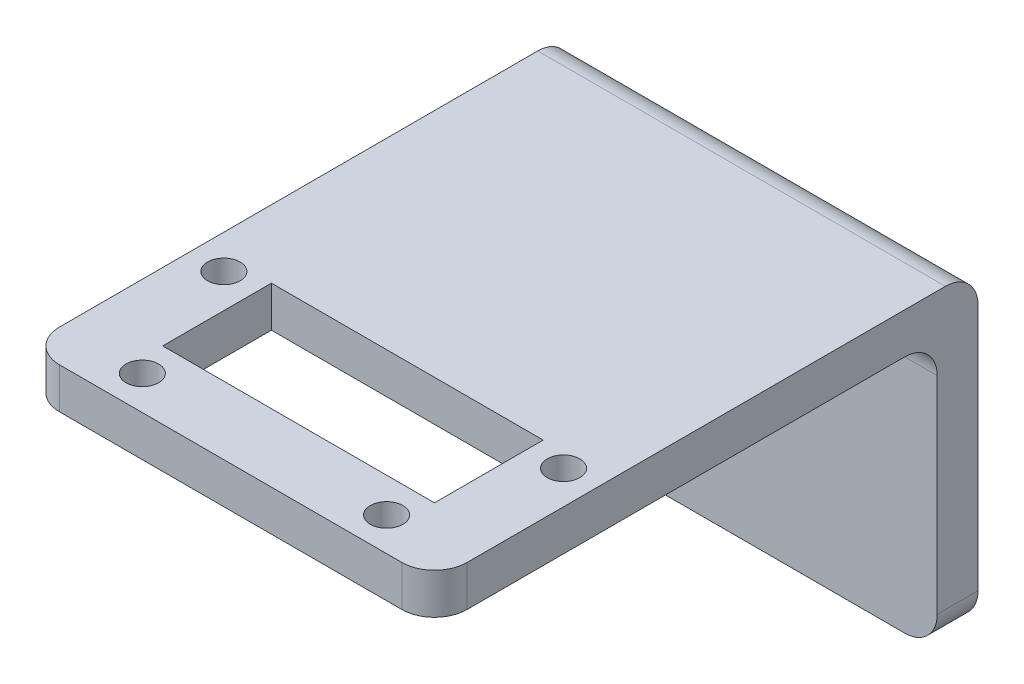
ISO-10303-21;
HEADER;
FILE_DESCRIPTION(('STEP AP214'),'2;1');
FILE_NAME('part.step','',(''),(''),'','','');
FILE_SCHEMA(('AUTOMOTIVE_DESIGN { 1 0 10303 214 1 1 1 1 }'));
ENDSEC;
DATA;
#1=APPLICATION_CONTEXT('core data for automotive mechanical design processes');
#2=APPLICATION_PROTOCOL_DEFINITION('international standard','automotive_design',2000,#1);
#3=PRODUCT_CONTEXT('',#1,'mechanical');
#4=PRODUCT('Part','Part','',(#3));
#5=PRODUCT_RELATED_PRODUCT_CATEGORY('part','',(#4));
#6=PRODUCT_DEFINITION_FORMATION('','',#4);
#7=PRODUCT_DEFINITION_CONTEXT('part definition',#1,'design');
#8=PRODUCT_DEFINITION('design','',#6,#7);
#9=PRODUCT_DEFINITION_SHAPE('','',#8);
#10=(LENGTH_UNIT() NAMED_UNIT(*) SI_UNIT(.MILLI.,.METRE.));
#11=(NAMED_UNIT(*) PLANE_ANGLE_UNIT() SI_UNIT($,.RADIAN.));
#12=(NAMED_UNIT(*) SI_UNIT($,.STERADIAN.) SOLID_ANGLE_UNIT());
#13=UNCERTAINTY_MEASURE_WITH_UNIT(LENGTH_MEASURE(1.E-05),#10,'distance_accuracy_value','');
#14=(GEOMETRIC_REPRESENTATION_CONTEXT(3) GLOBAL_UNCERTAINTY_ASSIGNED_CONTEXT((#13)) GLOBAL_UNIT_ASSIGNED_CONTEXT((#10,
#11,#12)) REPRESENTATION_CONTEXT('',''));
#15=CARTESIAN_POINT('',(0.,0.,0.));
#16=DIRECTION('',(0.,0.,1.));
#17=DIRECTION('',(1.,0.,0.));
#18=AXIS2_PLACEMENT_3D('',#15,#16,#17);
#19=CARTESIAN_POINT('',(0.,0.,0.));
#20=DIRECTION('',(0.,-1.,0.));
#21=DIRECTION('',(0.,0.,-1.));
#22=AXIS2_PLACEMENT_3D('',#19,#20,#21);
#23=PLANE('',#22);
#24=CARTESIAN_POINT('',(9.00935720361294,0.,17.5339337442584));
#25=DIRECTION('',(0.,-1.,0.));
#26=DIRECTION('',(0.,0.,1.));
#27=AXIS2_PLACEMENT_3D('',#24,#25,#26);
#28=CIRCLE('',#27,1.2);
#29=CARTESIAN_POINT('',(9.00935720361294,0.,18.7339337442584));
#30=VERTEX_POINT('',#29);
#31=EDGE_CURVE('E292',#30,#30,#28,.T.);
#32=ORIENTED_EDGE('',*,*,#31,.F.);
#33=EDGE_LOOP('',(#32));
#34=FACE_BOUND('',#33,.T.);
#35=CARTESIAN_POINT('',(-12.5,0.,8.));
#36=DIRECTION('',(0.,-1.,0.));
#37=DIRECTION('',(0.,0.,-1.));
#38=AXIS2_PLACEMENT_3D('',#35,#36,#37);
#39=CIRCLE('',#38,1.2);
#40=CARTESIAN_POINT('',(-12.5,0.,6.8));
#41=VERTEX_POINT('',#40);
#42=EDGE_CURVE('E305',#41,#41,#39,.T.);
#43=ORIENTED_EDGE('',*,*,#42,.F.);
#44=EDGE_LOOP('',(#43));
#45=FACE_BOUND('',#44,.T.);
#46=CARTESIAN_POINT('',(12.5451325660364,0.,8.04719075277392));
#47=DIRECTION('',(0.,-1.,0.));
#48=DIRECTION('',(0.,0.,1.));
#49=AXIS2_PLACEMENT_3D('',#46,#47,#48);
#50=CIRCLE('',#49,1.2);
#51=CARTESIAN_POINT('',(12.5451325660364,0.,9.24719075277392));
#52=VERTEX_POINT('',#51);
#53=EDGE_CURVE('E299',#52,#52,#50,.T.);
#54=ORIENTED_EDGE('',*,*,#53,.F.);
#55=EDGE_LOOP('',(#54));
#56=FACE_BOUND('',#55,.T.);
#57=CARTESIAN_POINT('',(-9.,0.,17.5));
#58=DIRECTION('',(0.,-1.,0.));
#59=DIRECTION('',(0.,0.,-1.));
#60=AXIS2_PLACEMENT_3D('',#57,#58,#59);
#61=CIRCLE('',#60,1.2);
#62=CARTESIAN_POINT('',(-9.,0.,16.3));
#63=VERTEX_POINT('',#62);
#64=EDGE_CURVE('E184',#63,#63,#61,.T.);
#65=ORIENTED_EDGE('',*,*,#64,.F.);
#66=EDGE_LOOP('',(#65));
#67=FACE_BOUND('',#66,.T.);
#68=DIRECTION('',(0.,0.,-1.));
#69=VECTOR('',#68,1.);
#70=CARTESIAN_POINT('',(10.,0.,7.00000000000001));
#71=LINE('',#70,#69);
#72=CARTESIAN_POINT('',(10.,0.,15.));
#73=VERTEX_POINT('',#72);
#74=CARTESIAN_POINT('',(10.,0.,7.00000000000001));
#75=VERTEX_POINT('',#74);
#76=EDGE_CURVE('E158',#73,#75,#71,.T.);
#77=ORIENTED_EDGE('',*,*,#76,.T.);
#78=DIRECTION('',(-1.,0.,0.));
#79=VECTOR('',#78,1.);
#80=CARTESIAN_POINT('',(-10.,0.,7.00000000000001));
#81=LINE('',#80,#79);
#82=CARTESIAN_POINT('',(-10.,0.,7.00000000000001));
#83=VERTEX_POINT('',#82);
#84=EDGE_CURVE('E170',#75,#83,#81,.T.);
#85=ORIENTED_EDGE('',*,*,#84,.T.);
#86=DIRECTION('',(0.,0.,1.));
#87=VECTOR('',#86,1.);
#88=CARTESIAN_POINT('',(-10.,0.,15.));
#89=LINE('',#88,#87);
#90=CARTESIAN_POINT('',(-10.,0.,15.));
#91=VERTEX_POINT('',#90);
#92=EDGE_CURVE('E174',#83,#91,#89,.T.);
#93=ORIENTED_EDGE('',*,*,#92,.T.);
#94=DIRECTION('',(1.,0.,0.));
#95=VECTOR('',#94,1.);
#96=CARTESIAN_POINT('',(10.,0.,15.));
#97=LINE('',#96,#95);
#98=EDGE_CURVE('E166',#91,#73,#97,.T.);
#99=ORIENTED_EDGE('',*,*,#98,.T.);
#100=EDGE_LOOP('',(#77,#85,#93,#99));
#101=FACE_BOUND('',#100,.T.);
#102=DIRECTION('',(0.,0.,-1.));
#103=VECTOR('',#102,1.);
#104=CARTESIAN_POINT('',(15.,0.,20.));
#105=LINE('',#104,#103);
#106=CARTESIAN_POINT('',(15.,0.,17.6));
#107=VERTEX_POINT('',#106);
#108=CARTESIAN_POINT('',(15.,0.,-14.6));
#109=VERTEX_POINT('',#108);
#110=EDGE_CURVE('E197',#107,#109,#105,.T.);
#111=ORIENTED_EDGE('',*,*,#110,.F.);
#112=CARTESIAN_POINT('',(12.6,0.,17.6));
#113=DIRECTION('',(0.,-1.,0.));
#114=DIRECTION('',(0.,0.,-1.));
#115=AXIS2_PLACEMENT_3D('',#112,#113,#114);
#116=CIRCLE('',#115,2.4);
#117=CARTESIAN_POINT('',(12.6,0.,20.));
#118=VERTEX_POINT('',#117);
#119=EDGE_CURVE('E246',#107,#118,#116,.T.);
#120=ORIENTED_EDGE('',*,*,#119,.T.);
#121=DIRECTION('',(1.,0.,0.));
#122=VECTOR('',#121,1.);
#123=CARTESIAN_POINT('',(-15.,0.,20.));
#124=LINE('',#123,#122);
#125=CARTESIAN_POINT('',(-12.6,0.,20.));
#126=VERTEX_POINT('',#125);
#127=EDGE_CURVE('E204',#126,#118,#124,.T.);
#128=ORIENTED_EDGE('',*,*,#127,.F.);
#129=CARTESIAN_POINT('',(-12.6,0.,17.6));
#130=DIRECTION('',(0.,-1.,0.));
#131=DIRECTION('',(0.,0.,-1.));
#132=AXIS2_PLACEMENT_3D('',#129,#130,#131);
#133=CIRCLE('',#132,2.4);
#134=CARTESIAN_POINT('',(-15.,0.,17.6));
#135=VERTEX_POINT('',#134);
#136=EDGE_CURVE('E244',#126,#135,#133,.T.);
#137=ORIENTED_EDGE('',*,*,#136,.T.);
#138=DIRECTION('',(0.,0.,1.));
#139=VECTOR('',#138,1.);
#140=CARTESIAN_POINT('',(-15.,0.,-20.));
#141=LINE('',#140,#139);
#142=CARTESIAN_POINT('',(-15.,0.,-14.6));
#143=VERTEX_POINT('',#142);
#144=EDGE_CURVE('E212',#143,#135,#141,.T.);
#145=ORIENTED_EDGE('',*,*,#144,.F.);
#146=DIRECTION('',(1.,0.,0.));
#147=VECTOR('',#146,1.);
#148=CARTESIAN_POINT('',(15.,0.,-14.6));
#149=LINE('',#148,#147);
#150=EDGE_CURVE('E220',#143,#109,#149,.T.);
#151=ORIENTED_EDGE('',*,*,#150,.T.);
#152=EDGE_LOOP('',(#111,#120,#128,#137,#145,#151));
#153=FACE_BOUND('',#152,.T.);
#154=ADVANCED_FACE('F39',(#34,#45,#56,#67,#101,#153),#23,.T.);
#155=CARTESIAN_POINT('',(15.,3.,20.));
#156=DIRECTION('',(-1.,0.,0.));
#157=DIRECTION('',(0.,0.,1.));
#158=AXIS2_PLACEMENT_3D('',#155,#156,#157);
#159=PLANE('',#158);
#160=DIRECTION('',(0.,1.,0.));
#161=VECTOR('',#160,1.);
#162=CARTESIAN_POINT('',(15.,-20.,-17.));
#163=LINE('',#162,#161);
#164=CARTESIAN_POINT('',(15.,-17.6,-17.));
#165=VERTEX_POINT('',#164);
#166=CARTESIAN_POINT('',(15.,-2.4,-17.));
#167=VERTEX_POINT('',#166);
#168=EDGE_CURVE('E281',#165,#167,#163,.T.);
#169=ORIENTED_EDGE('',*,*,#168,.F.);
#170=DIRECTION('',(0.,0.,1.));
#171=VECTOR('',#170,1.);
#172=CARTESIAN_POINT('',(15.,-17.6,-20.));
#173=LINE('',#172,#171);
#174=CARTESIAN_POINT('',(15.,-17.6,-20.));
#175=VERTEX_POINT('',#174);
#176=EDGE_CURVE('E62',#165,#175,#173,.F.);
#177=ORIENTED_EDGE('',*,*,#176,.T.);
#178=DIRECTION('',(0.,-1.,0.));
#179=VECTOR('',#178,1.);
#180=CARTESIAN_POINT('',(15.,3.,-20.));
#181=LINE('',#180,#179);
#182=CARTESIAN_POINT('',(15.,0.6,-20.));
#183=VERTEX_POINT('',#182);
#184=EDGE_CURVE('E218',#183,#175,#181,.T.);
#185=ORIENTED_EDGE('',*,*,#184,.F.);
#186=CARTESIAN_POINT('',(15.,0.6,-17.6));
#187=DIRECTION('',(-1.,0.,0.));
#188=DIRECTION('',(0.,0.,1.));
#189=AXIS2_PLACEMENT_3D('',#186,#187,#188);
#190=CIRCLE('',#189,2.4);
#191=CARTESIAN_POINT('',(15.,3.,-17.6));
#192=VERTEX_POINT('',#191);
#193=EDGE_CURVE('E238',#183,#192,#190,.F.);
#194=ORIENTED_EDGE('',*,*,#193,.T.);
#195=DIRECTION('',(0.,0.,-1.));
#196=VECTOR('',#195,1.);
#197=CARTESIAN_POINT('',(15.,3.,20.));
#198=LINE('',#197,#196);
#199=CARTESIAN_POINT('',(15.,3.,17.6));
#200=VERTEX_POINT('',#199);
#201=EDGE_CURVE('E201',#200,#192,#198,.T.);
#202=ORIENTED_EDGE('',*,*,#201,.F.);
#203=DIRECTION('',(0.,-1.,0.));
#204=VECTOR('',#203,1.);
#205=CARTESIAN_POINT('',(15.,3.,17.6));
#206=LINE('',#205,#204);
#207=EDGE_CURVE('E241',#200,#107,#206,.T.);
#208=ORIENTED_EDGE('',*,*,#207,.T.);
#209=ORIENTED_EDGE('',*,*,#110,.T.);
#210=CARTESIAN_POINT('',(15.,-2.4,-14.6));
#211=DIRECTION('',(-1.,0.,0.));
#212=DIRECTION('',(0.,0.,1.));
#213=AXIS2_PLACEMENT_3D('',#210,#211,#212);
#214=CIRCLE('',#213,2.4);
#215=EDGE_CURVE('E226',#109,#167,#214,.T.);
#216=ORIENTED_EDGE('',*,*,#215,.T.);
#217=EDGE_LOOP('',(#169,#177,#185,#194,#202,#208,#209,#216));
#218=FACE_BOUND('',#217,.T.);
#219=ADVANCED_FACE('F287',(#218),#159,.F.);
#220=CARTESIAN_POINT('',(-15.,3.,-20.));
#221=DIRECTION('',(0.,0.,1.));
#222=DIRECTION('',(1.,0.,0.));
#223=AXIS2_PLACEMENT_3D('',#220,#221,#222);
#224=PLANE('',#223);
#225=ORIENTED_EDGE('',*,*,#184,.T.);
#226=CARTESIAN_POINT('',(12.6,-17.6,-20.));
#227=DIRECTION('',(0.,0.,1.));
#228=DIRECTION('',(1.,0.,0.));
#229=AXIS2_PLACEMENT_3D('',#226,#227,#228);
#230=CIRCLE('',#229,2.4);
#231=CARTESIAN_POINT('',(12.6,-20.,-20.));
#232=VERTEX_POINT('',#231);
#233=EDGE_CURVE('E47',#175,#232,#230,.F.);
#234=ORIENTED_EDGE('',*,*,#233,.T.);
#235=DIRECTION('',(1.,0.,0.));
#236=VECTOR('',#235,1.);
#237=CARTESIAN_POINT('',(0.,-20.,-20.));
#238=LINE('',#237,#236);
#239=CARTESIAN_POINT('',(-12.6,-20.,-20.));
#240=VERTEX_POINT('',#239);
#241=EDGE_CURVE('E273',#240,#232,#238,.T.);
#242=ORIENTED_EDGE('',*,*,#241,.F.);
#243=CARTESIAN_POINT('',(-12.6,-17.6,-20.));
#244=DIRECTION('',(0.,0.,1.));
#245=DIRECTION('',(1.,0.,0.));
#246=AXIS2_PLACEMENT_3D('',#243,#244,#245);
#247=CIRCLE('',#246,2.4);
#248=CARTESIAN_POINT('',(-15.,-17.6,-20.));
#249=VERTEX_POINT('',#248);
#250=EDGE_CURVE('E54',#240,#249,#247,.F.);
#251=ORIENTED_EDGE('',*,*,#250,.T.);
#252=DIRECTION('',(0.,-1.,0.));
#253=VECTOR('',#252,1.);
#254=CARTESIAN_POINT('',(-15.,3.,-20.));
#255=LINE('',#254,#253);
#256=CARTESIAN_POINT('',(-15.,0.6,-20.));
#257=VERTEX_POINT('',#256);
#258=EDGE_CURVE('E210',#257,#249,#255,.T.);
#259=ORIENTED_EDGE('',*,*,#258,.F.);
#260=DIRECTION('',(-1.,0.,0.));
#261=VECTOR('',#260,1.);
#262=CARTESIAN_POINT('',(-15.,0.6,-20.));
#263=LINE('',#262,#261);
#264=EDGE_CURVE('E236',#257,#183,#263,.F.);
#265=ORIENTED_EDGE('',*,*,#264,.T.);
#266=EDGE_LOOP('',(#225,#234,#242,#251,#259,#265));
#267=FACE_BOUND('',#266,.T.);
#268=ADVANCED_FACE('F272',(#267),#224,.F.);
#269=CARTESIAN_POINT('',(-15.,3.,-20.));
#270=DIRECTION('',(1.,0.,0.));
#271=DIRECTION('',(0.,0.,-1.));
#272=AXIS2_PLACEMENT_3D('',#269,#270,#271);
#273=PLANE('',#272);
#274=ORIENTED_EDGE('',*,*,#258,.T.);
#275=DIRECTION('',(0.,0.,-1.));
#276=VECTOR('',#275,1.);
#277=CARTESIAN_POINT('',(-15.,-17.6,-17.));
#278=LINE('',#277,#276);
#279=CARTESIAN_POINT('',(-15.,-17.6,-17.));
#280=VERTEX_POINT('',#279);
#281=EDGE_CURVE('E11',#249,#280,#278,.F.);
#282=ORIENTED_EDGE('',*,*,#281,.T.);
#283=DIRECTION('',(0.,1.,0.));
#284=VECTOR('',#283,1.);
#285=CARTESIAN_POINT('',(-15.,-20.,-17.));
#286=LINE('',#285,#284);
#287=CARTESIAN_POINT('',(-15.,-2.4,-17.));
#288=VERTEX_POINT('',#287);
#289=EDGE_CURVE('E290',#280,#288,#286,.T.);
#290=ORIENTED_EDGE('',*,*,#289,.T.);
#291=CARTESIAN_POINT('',(-15.,-2.4,-14.6));
#292=DIRECTION('',(1.,0.,0.));
#293=DIRECTION('',(0.,0.,-1.));
#294=AXIS2_PLACEMENT_3D('',#291,#292,#293);
#295=CIRCLE('',#294,2.4);
#296=EDGE_CURVE('E229',#288,#143,#295,.T.);
#297=ORIENTED_EDGE('',*,*,#296,.T.);
#298=ORIENTED_EDGE('',*,*,#144,.T.);
#299=DIRECTION('',(0.,-1.,0.));
#300=VECTOR('',#299,1.);
#301=CARTESIAN_POINT('',(-15.,3.,17.6));
#302=LINE('',#301,#300);
#303=CARTESIAN_POINT('',(-15.,3.,17.6));
#304=VERTEX_POINT('',#303);
#305=EDGE_CURVE('E257',#135,#304,#302,.F.);
#306=ORIENTED_EDGE('',*,*,#305,.T.);
#307=DIRECTION('',(0.,0.,1.));
#308=VECTOR('',#307,1.);
#309=CARTESIAN_POINT('',(-15.,3.,-20.));
#310=LINE('',#309,#308);
#311=CARTESIAN_POINT('',(-15.,3.,-17.6));
#312=VERTEX_POINT('',#311);
#313=EDGE_CURVE('E203',#312,#304,#310,.T.);
#314=ORIENTED_EDGE('',*,*,#313,.F.);
#315=CARTESIAN_POINT('',(-15.,0.6,-17.6));
#316=DIRECTION('',(1.,0.,0.));
#317=DIRECTION('',(0.,0.,-1.));
#318=AXIS2_PLACEMENT_3D('',#315,#316,#317);
#319=CIRCLE('',#318,2.4);
#320=EDGE_CURVE('E234',#312,#257,#319,.F.);
#321=ORIENTED_EDGE('',*,*,#320,.T.);
#322=EDGE_LOOP('',(#274,#282,#290,#297,#298,#306,#314,#321));
#323=FACE_BOUND('',#322,.T.);
#324=ADVANCED_FACE('F336',(#323),#273,.F.);
#325=CARTESIAN_POINT('',(-15.,3.,20.));
#326=DIRECTION('',(0.,0.,-1.));
#327=DIRECTION('',(-1.,0.,0.));
#328=AXIS2_PLACEMENT_3D('',#325,#326,#327);
#329=PLANE('',#328);
#330=ORIENTED_EDGE('',*,*,#127,.T.);
#331=DIRECTION('',(0.,-1.,0.));
#332=VECTOR('',#331,1.);
#333=CARTESIAN_POINT('',(12.6,3.,20.));
#334=LINE('',#333,#332);
#335=CARTESIAN_POINT('',(12.6,3.,20.));
#336=VERTEX_POINT('',#335);
#337=EDGE_CURVE('E251',#118,#336,#334,.F.);
#338=ORIENTED_EDGE('',*,*,#337,.T.);
#339=DIRECTION('',(1.,0.,0.));
#340=VECTOR('',#339,1.);
#341=CARTESIAN_POINT('',(-15.,3.,20.));
#342=LINE('',#341,#340);
#343=CARTESIAN_POINT('',(-12.6,3.,20.));
#344=VERTEX_POINT('',#343);
#345=EDGE_CURVE('E207',#344,#336,#342,.T.);
#346=ORIENTED_EDGE('',*,*,#345,.F.);
#347=DIRECTION('',(0.,-1.,0.));
#348=VECTOR('',#347,1.);
#349=CARTESIAN_POINT('',(-12.6,3.,20.));
#350=LINE('',#349,#348);
#351=EDGE_CURVE('E248',#344,#126,#350,.T.);
#352=ORIENTED_EDGE('',*,*,#351,.T.);
#353=EDGE_LOOP('',(#330,#338,#346,#352));
#354=FACE_BOUND('',#353,.T.);
#355=ADVANCED_FACE('F333',(#354),#329,.F.);
#356=CARTESIAN_POINT('',(0.,3.,0.));
#357=DIRECTION('',(0.,-1.,0.));
#358=DIRECTION('',(0.,0.,-1.));
#359=AXIS2_PLACEMENT_3D('',#356,#357,#358);
#360=PLANE('',#359);
#361=CARTESIAN_POINT('',(9.00935720361294,3.,17.5339337442584));
#362=DIRECTION('',(0.,-1.,0.));
#363=DIRECTION('',(0.,0.,1.));
#364=AXIS2_PLACEMENT_3D('',#361,#362,#363);
#365=CIRCLE('',#364,1.2);
#366=CARTESIAN_POINT('',(9.00935720361294,3.,18.7339337442584));
#367=VERTEX_POINT('',#366);
#368=EDGE_CURVE('E308',#367,#367,#365,.T.);
#369=ORIENTED_EDGE('',*,*,#368,.T.);
#370=EDGE_LOOP('',(#369));
#371=FACE_BOUND('',#370,.T.);
#372=CARTESIAN_POINT('',(-12.5,3.,8.));
#373=DIRECTION('',(0.,-1.,0.));
#374=DIRECTION('',(0.,0.,-1.));
#375=AXIS2_PLACEMENT_3D('',#372,#373,#374);
#376=CIRCLE('',#375,1.2);
#377=CARTESIAN_POINT('',(-12.5,3.,6.8));
#378=VERTEX_POINT('',#377);
#379=EDGE_CURVE('E302',#378,#378,#376,.T.);
#380=ORIENTED_EDGE('',*,*,#379,.T.);
#381=EDGE_LOOP('',(#380));
#382=FACE_BOUND('',#381,.T.);
#383=CARTESIAN_POINT('',(12.5451325660364,3.,8.04719075277392));
#384=DIRECTION('',(0.,-1.,0.));
#385=DIRECTION('',(0.,0.,1.));
#386=AXIS2_PLACEMENT_3D('',#383,#384,#385);
#387=CIRCLE('',#386,1.2);
#388=CARTESIAN_POINT('',(12.5451325660364,3.,9.24719075277392));
#389=VERTEX_POINT('',#388);
#390=EDGE_CURVE('E296',#389,#389,#387,.T.);
#391=ORIENTED_EDGE('',*,*,#390,.T.);
#392=EDGE_LOOP('',(#391));
#393=FACE_BOUND('',#392,.T.);
#394=CARTESIAN_POINT('',(-9.,3.,17.5));
#395=DIRECTION('',(0.,-1.,0.));
#396=DIRECTION('',(0.,0.,-1.));
#397=AXIS2_PLACEMENT_3D('',#394,#395,#396);
#398=CIRCLE('',#397,1.2);
#399=CARTESIAN_POINT('',(-9.,3.,16.3));
#400=VERTEX_POINT('',#399);
#401=EDGE_CURVE('E191',#400,#400,#398,.T.);
#402=ORIENTED_EDGE('',*,*,#401,.T.);
#403=EDGE_LOOP('',(#402));
#404=FACE_BOUND('',#403,.T.);
#405=DIRECTION('',(-1.,0.,0.));
#406=VECTOR('',#405,1.);
#407=CARTESIAN_POINT('',(-10.,3.,7.00000000000001));
#408=LINE('',#407,#406);
#409=CARTESIAN_POINT('',(10.,3.,7.00000000000001));
#410=VERTEX_POINT('',#409);
#411=CARTESIAN_POINT('',(-10.,3.,7.00000000000001));
#412=VERTEX_POINT('',#411);
#413=EDGE_CURVE('E190',#410,#412,#408,.T.);
#414=ORIENTED_EDGE('',*,*,#413,.F.);
#415=DIRECTION('',(0.,0.,-1.));
#416=VECTOR('',#415,1.);
#417=CARTESIAN_POINT('',(10.,3.,7.00000000000001));
#418=LINE('',#417,#416);
#419=CARTESIAN_POINT('',(10.,3.,15.));
#420=VERTEX_POINT('',#419);
#421=EDGE_CURVE('E161',#420,#410,#418,.T.);
#422=ORIENTED_EDGE('',*,*,#421,.F.);
#423=DIRECTION('',(1.,0.,0.));
#424=VECTOR('',#423,1.);
#425=CARTESIAN_POINT('',(10.,3.,15.));
#426=LINE('',#425,#424);
#427=CARTESIAN_POINT('',(-10.,3.,15.));
#428=VERTEX_POINT('',#427);
#429=EDGE_CURVE('E178',#428,#420,#426,.T.);
#430=ORIENTED_EDGE('',*,*,#429,.F.);
#431=DIRECTION('',(0.,0.,1.));
#432=VECTOR('',#431,1.);
#433=CARTESIAN_POINT('',(-10.,3.,15.));
#434=LINE('',#433,#432);
#435=EDGE_CURVE('E181',#412,#428,#434,.T.);
#436=ORIENTED_EDGE('',*,*,#435,.F.);
#437=EDGE_LOOP('',(#414,#422,#430,#436));
#438=FACE_BOUND('',#437,.T.);
#439=ORIENTED_EDGE('',*,*,#345,.T.);
#440=CARTESIAN_POINT('',(12.6,3.,17.6));
#441=DIRECTION('',(0.,-1.,0.));
#442=DIRECTION('',(0.,0.,-1.));
#443=AXIS2_PLACEMENT_3D('',#440,#441,#442);
#444=CIRCLE('',#443,2.4);
#445=EDGE_CURVE('E255',#336,#200,#444,.F.);
#446=ORIENTED_EDGE('',*,*,#445,.T.);
#447=ORIENTED_EDGE('',*,*,#201,.T.);
#448=DIRECTION('',(-1.,0.,0.));
#449=VECTOR('',#448,1.);
#450=CARTESIAN_POINT('',(0.,3.,-17.6));
#451=LINE('',#450,#449);
#452=EDGE_CURVE('E231',#192,#312,#451,.T.);
#453=ORIENTED_EDGE('',*,*,#452,.T.);
#454=ORIENTED_EDGE('',*,*,#313,.T.);
#455=CARTESIAN_POINT('',(-12.6,3.,17.6));
#456=DIRECTION('',(0.,-1.,0.));
#457=DIRECTION('',(0.,0.,-1.));
#458=AXIS2_PLACEMENT_3D('',#455,#456,#457);
#459=CIRCLE('',#458,2.4);
#460=EDGE_CURVE('E253',#304,#344,#459,.F.);
#461=ORIENTED_EDGE('',*,*,#460,.T.);
#462=EDGE_LOOP('',(#439,#446,#447,#453,#454,#461));
#463=FACE_BOUND('',#462,.T.);
#464=ADVANCED_FACE('F331',(#371,#382,#393,#404,#438,#463),#360,.F.);
#465=CARTESIAN_POINT('',(10.,0.,7.00000000000001));
#466=DIRECTION('',(1.,0.,0.));
#467=DIRECTION('',(0.,0.,-1.));
#468=AXIS2_PLACEMENT_3D('',#465,#466,#467);
#469=PLANE('',#468);
#470=ORIENTED_EDGE('',*,*,#421,.T.);
#471=DIRECTION('',(0.,1.,0.));
#472=VECTOR('',#471,1.);
#473=CARTESIAN_POINT('',(10.,0.,7.00000000000001));
#474=LINE('',#473,#472);
#475=EDGE_CURVE('E154',#75,#410,#474,.T.);
#476=ORIENTED_EDGE('',*,*,#475,.F.);
#477=ORIENTED_EDGE('',*,*,#76,.F.);
#478=DIRECTION('',(0.,1.,0.));
#479=VECTOR('',#478,1.);
#480=CARTESIAN_POINT('',(10.,0.,15.));
#481=LINE('',#480,#479);
#482=EDGE_CURVE('E195',#73,#420,#481,.T.);
#483=ORIENTED_EDGE('',*,*,#482,.T.);
#484=EDGE_LOOP('',(#470,#476,#477,#483));
#485=FACE_BOUND('',#484,.T.);
#486=ADVANCED_FACE('F156',(#485),#469,.F.);
#487=CARTESIAN_POINT('',(10.,0.,15.));
#488=DIRECTION('',(0.,0.,1.));
#489=DIRECTION('',(1.,0.,0.));
#490=AXIS2_PLACEMENT_3D('',#487,#488,#489);
#491=PLANE('',#490);
#492=ORIENTED_EDGE('',*,*,#429,.T.);
#493=ORIENTED_EDGE('',*,*,#482,.F.);
#494=ORIENTED_EDGE('',*,*,#98,.F.);
#495=DIRECTION('',(0.,1.,0.));
#496=VECTOR('',#495,1.);
#497=CARTESIAN_POINT('',(-10.,0.,15.));
#498=LINE('',#497,#496);
#499=EDGE_CURVE('E198',#91,#428,#498,.T.);
#500=ORIENTED_EDGE('',*,*,#499,.T.);
#501=EDGE_LOOP('',(#492,#493,#494,#500));
#502=FACE_BOUND('',#501,.T.);
#503=ADVANCED_FACE('F391',(#502),#491,.F.);
#504=CARTESIAN_POINT('',(-10.,0.,15.));
#505=DIRECTION('',(-1.,0.,0.));
#506=DIRECTION('',(0.,0.,1.));
#507=AXIS2_PLACEMENT_3D('',#504,#505,#506);
#508=PLANE('',#507);
#509=ORIENTED_EDGE('',*,*,#435,.T.);
#510=ORIENTED_EDGE('',*,*,#499,.F.);
#511=ORIENTED_EDGE('',*,*,#92,.F.);
#512=DIRECTION('',(0.,1.,0.));
#513=VECTOR('',#512,1.);
#514=CARTESIAN_POINT('',(-10.,0.,7.00000000000001));
#515=LINE('',#514,#513);
#516=EDGE_CURVE('E165',#83,#412,#515,.T.);
#517=ORIENTED_EDGE('',*,*,#516,.T.);
#518=EDGE_LOOP('',(#509,#510,#511,#517));
#519=FACE_BOUND('',#518,.T.);
#520=ADVANCED_FACE('F401',(#519),#508,.F.);
#521=CARTESIAN_POINT('',(-10.,0.,7.00000000000001));
#522=DIRECTION('',(0.,0.,-1.));
#523=DIRECTION('',(-1.,0.,0.));
#524=AXIS2_PLACEMENT_3D('',#521,#522,#523);
#525=PLANE('',#524);
#526=ORIENTED_EDGE('',*,*,#413,.T.);
#527=ORIENTED_EDGE('',*,*,#516,.F.);
#528=ORIENTED_EDGE('',*,*,#84,.F.);
#529=ORIENTED_EDGE('',*,*,#475,.T.);
#530=EDGE_LOOP('',(#526,#527,#528,#529));
#531=FACE_BOUND('',#530,.T.);
#532=ADVANCED_FACE('F171',(#531),#525,.F.);
#533=CARTESIAN_POINT('',(-9.,3.,17.5));
#534=DIRECTION('',(0.,-1.,0.));
#535=DIRECTION('',(0.,0.,-1.));
#536=AXIS2_PLACEMENT_3D('',#533,#534,#535);
#537=CYLINDRICAL_SURFACE('',#536,1.2);
#538=ORIENTED_EDGE('',*,*,#401,.F.);
#539=EDGE_LOOP('',(#538));
#540=FACE_BOUND('',#539,.T.);
#541=ORIENTED_EDGE('',*,*,#64,.T.);
#542=EDGE_LOOP('',(#541));
#543=FACE_BOUND('',#542,.T.);
#544=ADVANCED_FACE('F318',(#540,#543),#537,.F.);
#545=CARTESIAN_POINT('',(12.5451325660364,3.,8.04719075277392));
#546=DIRECTION('',(0.,-1.,0.));
#547=DIRECTION('',(0.,0.,-1.));
#548=AXIS2_PLACEMENT_3D('',#545,#546,#547);
#549=CYLINDRICAL_SURFACE('',#548,1.2);
#550=ORIENTED_EDGE('',*,*,#390,.F.);
#551=EDGE_LOOP('',(#550));
#552=FACE_BOUND('',#551,.T.);
#553=ORIENTED_EDGE('',*,*,#53,.T.);
#554=EDGE_LOOP('',(#553));
#555=FACE_BOUND('',#554,.T.);
#556=ADVANCED_FACE('F416',(#552,#555),#549,.F.);
#557=CARTESIAN_POINT('',(-12.5,3.,8.));
#558=DIRECTION('',(0.,-1.,0.));
#559=DIRECTION('',(0.,0.,-1.));
#560=AXIS2_PLACEMENT_3D('',#557,#558,#559);
#561=CYLINDRICAL_SURFACE('',#560,1.2);
#562=ORIENTED_EDGE('',*,*,#379,.F.);
#563=EDGE_LOOP('',(#562));
#564=FACE_BOUND('',#563,.T.);
#565=ORIENTED_EDGE('',*,*,#42,.T.);
#566=EDGE_LOOP('',(#565));
#567=FACE_BOUND('',#566,.T.);
#568=ADVANCED_FACE('F421',(#564,#567),#561,.F.);
#569=CARTESIAN_POINT('',(9.00935720361294,3.,17.5339337442584));
#570=DIRECTION('',(0.,-1.,0.));
#571=DIRECTION('',(0.,0.,-1.));
#572=AXIS2_PLACEMENT_3D('',#569,#570,#571);
#573=CYLINDRICAL_SURFACE('',#572,1.2);
#574=ORIENTED_EDGE('',*,*,#368,.F.);
#575=EDGE_LOOP('',(#574));
#576=FACE_BOUND('',#575,.T.);
#577=ORIENTED_EDGE('',*,*,#31,.T.);
#578=EDGE_LOOP('',(#577));
#579=FACE_BOUND('',#578,.T.);
#580=ADVANCED_FACE('F427',(#576,#579),#573,.F.);
#581=CARTESIAN_POINT('',(0.,-20.,-17.));
#582=DIRECTION('',(0.,0.,1.));
#583=DIRECTION('',(1.,0.,0.));
#584=AXIS2_PLACEMENT_3D('',#581,#582,#583);
#585=PLANE('',#584);
#586=DIRECTION('',(1.,0.,0.));
#587=VECTOR('',#586,1.);
#588=CARTESIAN_POINT('',(0.,-20.,-17.));
#589=LINE('',#588,#587);
#590=CARTESIAN_POINT('',(-12.6,-20.,-17.));
#591=VERTEX_POINT('',#590);
#592=CARTESIAN_POINT('',(12.6,-20.,-17.));
#593=VERTEX_POINT('',#592);
#594=EDGE_CURVE('E282',#591,#593,#589,.T.);
#595=ORIENTED_EDGE('',*,*,#594,.T.);
#596=CARTESIAN_POINT('',(12.6,-17.6,-17.));
#597=DIRECTION('',(0.,0.,1.));
#598=DIRECTION('',(1.,0.,0.));
#599=AXIS2_PLACEMENT_3D('',#596,#597,#598);
#600=CIRCLE('',#599,2.4);
#601=EDGE_CURVE('E267',#593,#165,#600,.T.);
#602=ORIENTED_EDGE('',*,*,#601,.T.);
#603=ORIENTED_EDGE('',*,*,#168,.T.);
#604=DIRECTION('',(1.,0.,0.));
#605=VECTOR('',#604,1.);
#606=CARTESIAN_POINT('',(-15.,-2.4,-17.));
#607=LINE('',#606,#605);
#608=EDGE_CURVE('E223',#167,#288,#607,.F.);
#609=ORIENTED_EDGE('',*,*,#608,.T.);
#610=ORIENTED_EDGE('',*,*,#289,.F.);
#611=CARTESIAN_POINT('',(-12.6,-17.6,-17.));
#612=DIRECTION('',(0.,0.,1.));
#613=DIRECTION('',(1.,0.,0.));
#614=AXIS2_PLACEMENT_3D('',#611,#612,#613);
#615=CIRCLE('',#614,2.4);
#616=EDGE_CURVE('E265',#280,#591,#615,.T.);
#617=ORIENTED_EDGE('',*,*,#616,.T.);
#618=EDGE_LOOP('',(#595,#602,#603,#609,#610,#617));
#619=FACE_BOUND('',#618,.T.);
#620=ADVANCED_FACE('F286',(#619),#585,.T.);
#621=CARTESIAN_POINT('',(0.,-20.,0.));
#622=DIRECTION('',(0.,-1.,0.));
#623=DIRECTION('',(0.,0.,-1.));
#624=AXIS2_PLACEMENT_3D('',#621,#622,#623);
#625=PLANE('',#624);
#626=ORIENTED_EDGE('',*,*,#241,.T.);
#627=DIRECTION('',(0.,0.,1.));
#628=VECTOR('',#627,1.);
#629=CARTESIAN_POINT('',(12.6,-20.,-17.));
#630=LINE('',#629,#628);
#631=EDGE_CURVE('E262',#232,#593,#630,.T.);
#632=ORIENTED_EDGE('',*,*,#631,.T.);
#633=ORIENTED_EDGE('',*,*,#594,.F.);
#634=DIRECTION('',(0.,0.,-1.));
#635=VECTOR('',#634,1.);
#636=CARTESIAN_POINT('',(-12.6,-20.,-20.));
#637=LINE('',#636,#635);
#638=EDGE_CURVE('E259',#591,#240,#637,.T.);
#639=ORIENTED_EDGE('',*,*,#638,.T.);
#640=EDGE_LOOP('',(#626,#632,#633,#639));
#641=FACE_BOUND('',#640,.T.);
#642=ADVANCED_FACE('F277',(#641),#625,.T.);
#643=CARTESIAN_POINT('',(0.,-2.4,-14.6));
#644=DIRECTION('',(-1.,0.,0.));
#645=DIRECTION('',(0.,0.,1.));
#646=AXIS2_PLACEMENT_3D('',#643,#644,#645);
#647=CYLINDRICAL_SURFACE('',#646,2.4);
#648=ORIENTED_EDGE('',*,*,#296,.F.);
#649=ORIENTED_EDGE('',*,*,#608,.F.);
#650=ORIENTED_EDGE('',*,*,#215,.F.);
#651=ORIENTED_EDGE('',*,*,#150,.F.);
#652=EDGE_LOOP('',(#648,#649,#650,#651));
#653=FACE_BOUND('',#652,.T.);
#654=ADVANCED_FACE('F343',(#653),#647,.F.);
#655=CARTESIAN_POINT('',(0.,0.6,-17.6));
#656=DIRECTION('',(-1.,0.,0.));
#657=DIRECTION('',(0.,0.,1.));
#658=AXIS2_PLACEMENT_3D('',#655,#656,#657);
#659=CYLINDRICAL_SURFACE('',#658,2.4);
#660=ORIENTED_EDGE('',*,*,#193,.F.);
#661=ORIENTED_EDGE('',*,*,#264,.F.);
#662=ORIENTED_EDGE('',*,*,#320,.F.);
#663=ORIENTED_EDGE('',*,*,#452,.F.);
#664=EDGE_LOOP('',(#660,#661,#662,#663));
#665=FACE_BOUND('',#664,.T.);
#666=ADVANCED_FACE('F346',(#665),#659,.T.);
#667=CARTESIAN_POINT('',(12.6,3.,17.6));
#668=DIRECTION('',(0.,-1.,0.));
#669=DIRECTION('',(0.,0.,-1.));
#670=AXIS2_PLACEMENT_3D('',#667,#668,#669);
#671=CYLINDRICAL_SURFACE('',#670,2.4);
#672=ORIENTED_EDGE('',*,*,#445,.F.);
#673=ORIENTED_EDGE('',*,*,#337,.F.);
#674=ORIENTED_EDGE('',*,*,#119,.F.);
#675=ORIENTED_EDGE('',*,*,#207,.F.);
#676=EDGE_LOOP('',(#672,#673,#674,#675));
#677=FACE_BOUND('',#676,.T.);
#678=ADVANCED_FACE('F350',(#677),#671,.T.);
#679=CARTESIAN_POINT('',(-12.6,3.,17.6));
#680=DIRECTION('',(0.,-1.,0.));
#681=DIRECTION('',(0.,0.,-1.));
#682=AXIS2_PLACEMENT_3D('',#679,#680,#681);
#683=CYLINDRICAL_SURFACE('',#682,2.4);
#684=ORIENTED_EDGE('',*,*,#460,.F.);
#685=ORIENTED_EDGE('',*,*,#305,.F.);
#686=ORIENTED_EDGE('',*,*,#136,.F.);
#687=ORIENTED_EDGE('',*,*,#351,.F.);
#688=EDGE_LOOP('',(#684,#685,#686,#687));
#689=FACE_BOUND('',#688,.T.);
#690=ADVANCED_FACE('F354',(#689),#683,.T.);
#691=CARTESIAN_POINT('',(12.6,-17.6,0.));
#692=DIRECTION('',(0.,0.,-1.));
#693=DIRECTION('',(-1.,0.,0.));
#694=AXIS2_PLACEMENT_3D('',#691,#692,#693);
#695=CYLINDRICAL_SURFACE('',#694,2.4);
#696=ORIENTED_EDGE('',*,*,#233,.F.);
#697=ORIENTED_EDGE('',*,*,#176,.F.);
#698=ORIENTED_EDGE('',*,*,#601,.F.);
#699=ORIENTED_EDGE('',*,*,#631,.F.);
#700=EDGE_LOOP('',(#696,#697,#698,#699));
#701=FACE_BOUND('',#700,.T.);
#702=ADVANCED_FACE('F284',(#701),#695,.T.);
#703=CARTESIAN_POINT('',(-12.6,-17.6,0.));
#704=DIRECTION('',(0.,0.,1.));
#705=DIRECTION('',(1.,0.,0.));
#706=AXIS2_PLACEMENT_3D('',#703,#704,#705);
#707=CYLINDRICAL_SURFACE('',#706,2.4);
#708=ORIENTED_EDGE('',*,*,#616,.F.);
#709=ORIENTED_EDGE('',*,*,#281,.F.);
#710=ORIENTED_EDGE('',*,*,#250,.F.);
#711=ORIENTED_EDGE('',*,*,#638,.F.);
#712=EDGE_LOOP('',(#708,#709,#710,#711));
#713=FACE_BOUND('',#712,.T.);
#714=ADVANCED_FACE('F41',(#713),#707,.T.);
#715=CLOSED_SHELL('',(#154,#219,#268,#324,#355,#464,#486,#503,#520,#532,#544,#556,#568,#580,
#620,#642,#654,#666,#678,#690,#702,#714));
#716=MANIFOLD_SOLID_BREP('B2',#715);
#717=ADVANCED_BREP_SHAPE_REPRESENTATION('',(#18,#716),#14);
#718=SHAPE_DEFINITION_REPRESENTATION(#9,#717);
ENDSEC;
END-ISO-10303-21;
